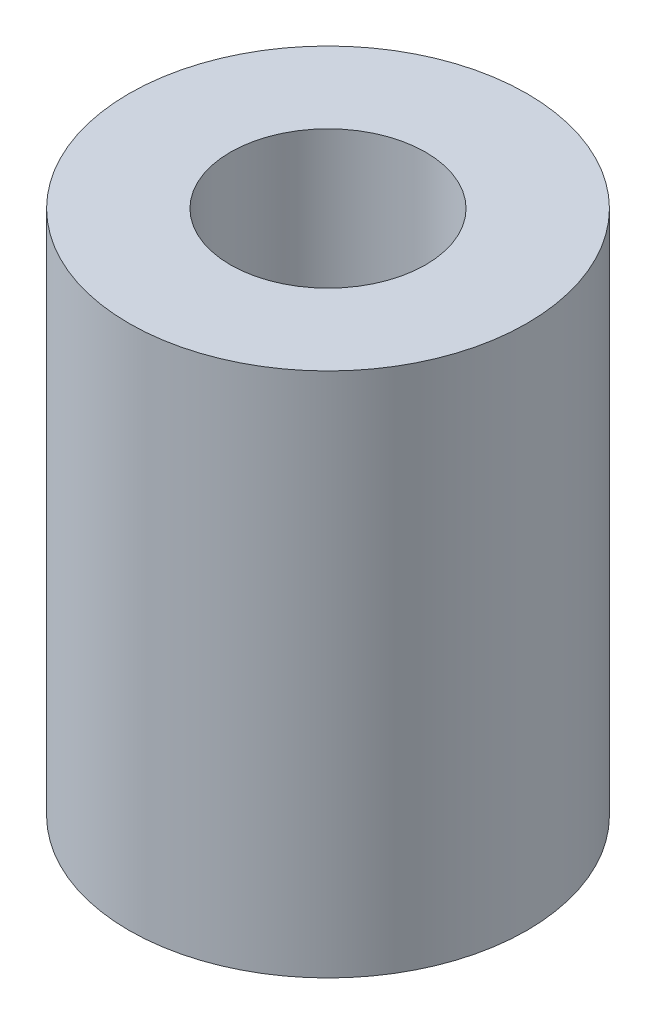
ISO-10303-21;
HEADER;
FILE_DESCRIPTION(('STEP AP214'),'2;1');
FILE_NAME('part.step','',(''),(''),'','','');
FILE_SCHEMA(('AUTOMOTIVE_DESIGN { 1 0 10303 214 1 1 1 1 }'));
ENDSEC;
DATA;
#1=APPLICATION_CONTEXT('core data for automotive mechanical design processes');
#2=APPLICATION_PROTOCOL_DEFINITION('international standard','automotive_design',2000,#1);
#3=PRODUCT_CONTEXT('',#1,'mechanical');
#4=PRODUCT('Part','Part','',(#3));
#5=PRODUCT_RELATED_PRODUCT_CATEGORY('part','',(#4));
#6=PRODUCT_DEFINITION_FORMATION('','',#4);
#7=PRODUCT_DEFINITION_CONTEXT('part definition',#1,'design');
#8=PRODUCT_DEFINITION('design','',#6,#7);
#9=PRODUCT_DEFINITION_SHAPE('','',#8);
#10=(LENGTH_UNIT() NAMED_UNIT(*) SI_UNIT(.MILLI.,.METRE.));
#11=(NAMED_UNIT(*) PLANE_ANGLE_UNIT() SI_UNIT($,.RADIAN.));
#12=(NAMED_UNIT(*) SI_UNIT($,.STERADIAN.) SOLID_ANGLE_UNIT());
#13=UNCERTAINTY_MEASURE_WITH_UNIT(LENGTH_MEASURE(1.E-05),#10,'distance_accuracy_value','');
#14=(GEOMETRIC_REPRESENTATION_CONTEXT(3) GLOBAL_UNCERTAINTY_ASSIGNED_CONTEXT((#13)) GLOBAL_UNIT_ASSIGNED_CONTEXT((#10,
#11,#12)) REPRESENTATION_CONTEXT('',''));
#15=CARTESIAN_POINT('',(0.,0.,0.));
#16=DIRECTION('',(0.,0.,1.));
#17=DIRECTION('',(1.,0.,0.));
#18=AXIS2_PLACEMENT_3D('',#15,#16,#17);
#19=CARTESIAN_POINT('',(0.,7.,0.));
#20=DIRECTION('',(0.,1.,0.));
#21=DIRECTION('',(0.,0.,1.));
#22=AXIS2_PLACEMENT_3D('',#19,#20,#21);
#23=PLANE('',#22);
#24=CARTESIAN_POINT('',(0.,7.,0.));
#25=DIRECTION('',(0.,1.,0.));
#26=DIRECTION('',(0.,0.,1.));
#27=AXIS2_PLACEMENT_3D('',#24,#25,#26);
#28=CIRCLE('',#27,2.65);
#29=CARTESIAN_POINT('',(0.,7.,2.65));
#30=VERTEX_POINT('',#29);
#31=EDGE_CURVE('E10',#30,#30,#28,.T.);
#32=ORIENTED_EDGE('',*,*,#31,.T.);
#33=EDGE_LOOP('',(#32));
#34=FACE_BOUND('',#33,.T.);
#35=CARTESIAN_POINT('',(0.,7.,0.));
#36=DIRECTION('',(0.,1.,0.));
#37=DIRECTION('',(0.,0.,1.));
#38=AXIS2_PLACEMENT_3D('',#35,#36,#37);
#39=CIRCLE('',#38,1.3);
#40=CARTESIAN_POINT('',(0.,7.,1.3));
#41=VERTEX_POINT('',#40);
#42=EDGE_CURVE('E55',#41,#41,#39,.T.);
#43=ORIENTED_EDGE('',*,*,#42,.F.);
#44=EDGE_LOOP('',(#43));
#45=FACE_BOUND('',#44,.T.);
#46=ADVANCED_FACE('F41',(#34,#45),#23,.T.);
#47=CARTESIAN_POINT('',(0.,0.,0.));
#48=DIRECTION('',(0.,1.,0.));
#49=DIRECTION('',(0.,0.,1.));
#50=AXIS2_PLACEMENT_3D('',#47,#48,#49);
#51=PLANE('',#50);
#52=CARTESIAN_POINT('',(0.,0.,0.));
#53=DIRECTION('',(0.,1.,0.));
#54=DIRECTION('',(0.,0.,1.));
#55=AXIS2_PLACEMENT_3D('',#52,#53,#54);
#56=CIRCLE('',#55,2.65);
#57=CARTESIAN_POINT('',(0.,0.,2.65));
#58=VERTEX_POINT('',#57);
#59=EDGE_CURVE('E45',#58,#58,#56,.T.);
#60=ORIENTED_EDGE('',*,*,#59,.F.);
#61=EDGE_LOOP('',(#60));
#62=FACE_BOUND('',#61,.T.);
#63=CARTESIAN_POINT('',(0.,0.,0.));
#64=DIRECTION('',(0.,1.,0.));
#65=DIRECTION('',(0.,0.,1.));
#66=AXIS2_PLACEMENT_3D('',#63,#64,#65);
#67=CIRCLE('',#66,1.3);
#68=CARTESIAN_POINT('',(0.,0.,1.3));
#69=VERTEX_POINT('',#68);
#70=EDGE_CURVE('E57',#69,#69,#67,.T.);
#71=ORIENTED_EDGE('',*,*,#70,.T.);
#72=EDGE_LOOP('',(#71));
#73=FACE_BOUND('',#72,.T.);
#74=ADVANCED_FACE('F68',(#62,#73),#51,.F.);
#75=CARTESIAN_POINT('',(0.,7.,0.));
#76=DIRECTION('',(0.,-1.,0.));
#77=DIRECTION('',(0.,0.,-1.));
#78=AXIS2_PLACEMENT_3D('',#75,#76,#77);
#79=CYLINDRICAL_SURFACE('',#78,2.65);
#80=ORIENTED_EDGE('',*,*,#31,.F.);
#81=EDGE_LOOP('',(#80));
#82=FACE_BOUND('',#81,.T.);
#83=ORIENTED_EDGE('',*,*,#59,.T.);
#84=EDGE_LOOP('',(#83));
#85=FACE_BOUND('',#84,.T.);
#86=ADVANCED_FACE('F43',(#82,#85),#79,.T.);
#87=CARTESIAN_POINT('',(0.,7.,0.));
#88=DIRECTION('',(0.,-1.,0.));
#89=DIRECTION('',(0.,0.,-1.));
#90=AXIS2_PLACEMENT_3D('',#87,#88,#89);
#91=CYLINDRICAL_SURFACE('',#90,1.3);
#92=ORIENTED_EDGE('',*,*,#42,.T.);
#93=EDGE_LOOP('',(#92));
#94=FACE_BOUND('',#93,.T.);
#95=ORIENTED_EDGE('',*,*,#70,.F.);
#96=EDGE_LOOP('',(#95));
#97=FACE_BOUND('',#96,.T.);
#98=ADVANCED_FACE('F64',(#94,#97),#91,.F.);
#99=CLOSED_SHELL('',(#46,#74,#86,#98));
#100=MANIFOLD_SOLID_BREP('B2',#99);
#101=ADVANCED_BREP_SHAPE_REPRESENTATION('',(#18,#100),#14);
#102=SHAPE_DEFINITION_REPRESENTATION(#9,#101);
ENDSEC;
END-ISO-10303-21;
